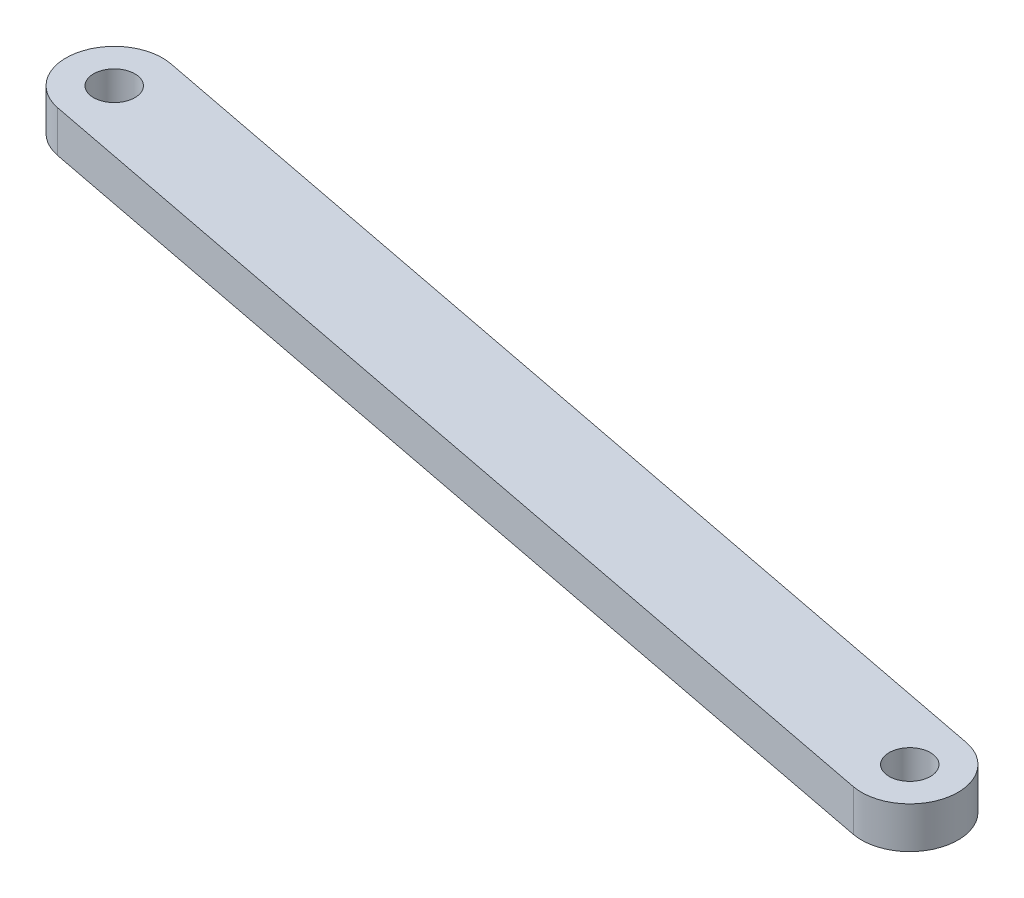
ISO-10303-21;
HEADER;
FILE_DESCRIPTION(('STEP AP214'),'2;1');
FILE_NAME('part.step','',(''),(''),'','','');
FILE_SCHEMA(('AUTOMOTIVE_DESIGN { 1 0 10303 214 1 1 1 1 }'));
ENDSEC;
DATA;
#1=APPLICATION_CONTEXT('core data for automotive mechanical design processes');
#2=APPLICATION_PROTOCOL_DEFINITION('international standard','automotive_design',2000,#1);
#3=PRODUCT_CONTEXT('',#1,'mechanical');
#4=PRODUCT('Part','Part','',(#3));
#5=PRODUCT_RELATED_PRODUCT_CATEGORY('part','',(#4));
#6=PRODUCT_DEFINITION_FORMATION('','',#4);
#7=PRODUCT_DEFINITION_CONTEXT('part definition',#1,'design');
#8=PRODUCT_DEFINITION('design','',#6,#7);
#9=PRODUCT_DEFINITION_SHAPE('','',#8);
#10=(LENGTH_UNIT() NAMED_UNIT(*) SI_UNIT(.MILLI.,.METRE.));
#11=(NAMED_UNIT(*) PLANE_ANGLE_UNIT() SI_UNIT($,.RADIAN.));
#12=(NAMED_UNIT(*) SI_UNIT($,.STERADIAN.) SOLID_ANGLE_UNIT());
#13=UNCERTAINTY_MEASURE_WITH_UNIT(LENGTH_MEASURE(1.E-05),#10,'distance_accuracy_value','');
#14=(GEOMETRIC_REPRESENTATION_CONTEXT(3) GLOBAL_UNCERTAINTY_ASSIGNED_CONTEXT((#13)) GLOBAL_UNIT_ASSIGNED_CONTEXT((#10,
#11,#12)) REPRESENTATION_CONTEXT('',''));
#15=CARTESIAN_POINT('',(0.,0.,0.));
#16=DIRECTION('',(0.,0.,1.));
#17=DIRECTION('',(1.,0.,0.));
#18=AXIS2_PLACEMENT_3D('',#15,#16,#17);
#19=CARTESIAN_POINT('',(-5.00000060963349,87.0000000000011,-87.4999997220752));
#20=DIRECTION('',(0.,-1.,0.));
#21=DIRECTION('',(0.,0.,-1.));
#22=AXIS2_PLACEMENT_3D('',#19,#20,#21);
#23=CYLINDRICAL_SURFACE('',#22,3.50000000000001);
#24=CARTESIAN_POINT('',(-5.00000060963349,84.0000000000011,-87.4999997220752));
#25=DIRECTION('',(0.,1.,0.));
#26=DIRECTION('',(0.,0.,1.));
#27=AXIS2_PLACEMENT_3D('',#24,#25,#26);
#28=CIRCLE('',#27,3.50000000000001);
#29=CARTESIAN_POINT('',(-4.33725103951117,84.0000000000011,-90.9366787887474));
#30=VERTEX_POINT('',#29);
#31=CARTESIAN_POINT('',(-5.66275017975581,84.0000000000011,-84.063320655403));
#32=VERTEX_POINT('',#31);
#33=EDGE_CURVE('E109',#30,#32,#28,.F.);
#34=ORIENTED_EDGE('',*,*,#33,.F.);
#35=DIRECTION('',(0.,-1.,0.));
#36=VECTOR('',#35,1.);
#37=CARTESIAN_POINT('',(-4.33725103951117,87.0000000000011,-90.9366787887474));
#38=LINE('',#37,#36);
#39=CARTESIAN_POINT('',(-4.33725103951117,87.0000000000011,-90.9366787887474));
#40=VERTEX_POINT('',#39);
#41=EDGE_CURVE('E11',#40,#30,#38,.T.);
#42=ORIENTED_EDGE('',*,*,#41,.F.);
#43=CARTESIAN_POINT('',(-5.00000060963349,87.0000000000011,-87.4999997220752));
#44=DIRECTION('',(0.,1.,0.));
#45=DIRECTION('',(0.,0.,1.));
#46=AXIS2_PLACEMENT_3D('',#43,#44,#45);
#47=CIRCLE('',#46,3.50000000000001);
#48=CARTESIAN_POINT('',(-5.66275017975581,87.0000000000011,-84.063320655403));
#49=VERTEX_POINT('',#48);
#50=EDGE_CURVE('E95',#40,#49,#47,.F.);
#51=ORIENTED_EDGE('',*,*,#50,.T.);
#52=DIRECTION('',(0.,-1.,0.));
#53=VECTOR('',#52,1.);
#54=CARTESIAN_POINT('',(-5.66275017975581,87.0000000000011,-84.063320655403));
#55=LINE('',#54,#53);
#56=EDGE_CURVE('E55',#49,#32,#55,.T.);
#57=ORIENTED_EDGE('',*,*,#56,.T.);
#58=EDGE_LOOP('',(#34,#42,#51,#57));
#59=FACE_BOUND('',#58,.T.);
#60=ADVANCED_FACE('F39',(#59),#23,.T.);
#61=CARTESIAN_POINT('',(16.7524517634441,87.0000000000011,-86.8696154419797));
#62=DIRECTION('',(0.189357020034949,0.,-0.981908304763476));
#63=DIRECTION('',(-0.981908304763476,0.,-0.189357020034949));
#64=AXIS2_PLACEMENT_3D('',#61,#62,#63);
#65=PLANE('',#64);
#66=DIRECTION('',(0.981908304763476,0.,0.189357020034949));
#67=VECTOR('',#66,1.);
#68=CARTESIAN_POINT('',(16.7524517634441,84.0000000000011,-86.8696154419797));
#69=LINE('',#68,#67);
#70=CARTESIAN_POINT('',(-75.8418948291045,84.0000000000011,-104.726058307153));
#71=VERTEX_POINT('',#70);
#72=EDGE_CURVE('E85',#71,#30,#69,.T.);
#73=ORIENTED_EDGE('',*,*,#72,.F.);
#74=DIRECTION('',(0.,-1.,0.));
#75=VECTOR('',#74,1.);
#76=CARTESIAN_POINT('',(-75.8418948291045,87.0000000000011,-104.726058307153));
#77=LINE('',#76,#75);
#78=CARTESIAN_POINT('',(-75.8418948291045,87.0000000000011,-104.726058307153));
#79=VERTEX_POINT('',#78);
#80=EDGE_CURVE('E47',#79,#71,#77,.T.);
#81=ORIENTED_EDGE('',*,*,#80,.F.);
#82=DIRECTION('',(0.981908304763476,0.,0.189357020034949));
#83=VECTOR('',#82,1.);
#84=CARTESIAN_POINT('',(16.7524517634441,87.0000000000011,-86.8696154419797));
#85=LINE('',#84,#83);
#86=EDGE_CURVE('E83',#79,#40,#85,.T.);
#87=ORIENTED_EDGE('',*,*,#86,.T.);
#88=ORIENTED_EDGE('',*,*,#41,.T.);
#89=EDGE_LOOP('',(#73,#81,#87,#88));
#90=FACE_BOUND('',#89,.T.);
#91=ADVANCED_FACE('F82',(#90),#65,.T.);
#92=CARTESIAN_POINT('',(-76.5046443992268,87.0000000000011,-101.289379240481));
#93=DIRECTION('',(0.,-1.,0.));
#94=DIRECTION('',(0.,0.,-1.));
#95=AXIS2_PLACEMENT_3D('',#92,#93,#94);
#96=CYLINDRICAL_SURFACE('',#95,3.50000000000001);
#97=CARTESIAN_POINT('',(-76.5046443992268,84.0000000000011,-101.289379240481));
#98=DIRECTION('',(0.,1.,0.));
#99=DIRECTION('',(0.,0.,1.));
#100=AXIS2_PLACEMENT_3D('',#97,#98,#99);
#101=CIRCLE('',#100,3.50000000000001);
#102=CARTESIAN_POINT('',(-77.1673939693492,84.0000000000011,-97.8527001738087));
#103=VERTEX_POINT('',#102);
#104=EDGE_CURVE('E112',#103,#71,#101,.F.);
#105=ORIENTED_EDGE('',*,*,#104,.F.);
#106=DIRECTION('',(0.,-1.,0.));
#107=VECTOR('',#106,1.);
#108=CARTESIAN_POINT('',(-77.1673939693492,87.0000000000011,-97.8527001738087));
#109=LINE('',#108,#107);
#110=CARTESIAN_POINT('',(-77.1673939693492,87.0000000000011,-97.8527001738087));
#111=VERTEX_POINT('',#110);
#112=EDGE_CURVE('E68',#111,#103,#109,.T.);
#113=ORIENTED_EDGE('',*,*,#112,.F.);
#114=CARTESIAN_POINT('',(-76.5046443992268,87.0000000000011,-101.289379240481));
#115=DIRECTION('',(0.,1.,0.));
#116=DIRECTION('',(0.,0.,1.));
#117=AXIS2_PLACEMENT_3D('',#114,#115,#116);
#118=CIRCLE('',#117,3.50000000000001);
#119=EDGE_CURVE('E94',#111,#79,#118,.F.);
#120=ORIENTED_EDGE('',*,*,#119,.T.);
#121=ORIENTED_EDGE('',*,*,#80,.T.);
#122=EDGE_LOOP('',(#105,#113,#120,#121));
#123=FACE_BOUND('',#122,.T.);
#124=ADVANCED_FACE('F97',(#123),#96,.T.);
#125=CARTESIAN_POINT('',(-5.00000060963349,87.0000000000011,-87.4999997220752));
#126=DIRECTION('',(0.,-1.,0.));
#127=DIRECTION('',(0.,0.,-1.));
#128=AXIS2_PLACEMENT_3D('',#125,#126,#127);
#129=CYLINDRICAL_SURFACE('',#128,1.5);
#130=CARTESIAN_POINT('',(-5.00000060963349,87.0000000000011,-87.4999997220752));
#131=DIRECTION('',(0.,1.,0.));
#132=DIRECTION('',(0.,0.,1.));
#133=AXIS2_PLACEMENT_3D('',#130,#131,#132);
#134=CIRCLE('',#133,1.5);
#135=CARTESIAN_POINT('',(-5.00000060963349,87.0000000000011,-85.9999997220752));
#136=VERTEX_POINT('',#135);
#137=EDGE_CURVE('E100',#136,#136,#134,.F.);
#138=ORIENTED_EDGE('',*,*,#137,.F.);
#139=EDGE_LOOP('',(#138));
#140=FACE_BOUND('',#139,.T.);
#141=CARTESIAN_POINT('',(-5.00000060963349,84.0000000000011,-87.4999997220752));
#142=DIRECTION('',(0.,1.,0.));
#143=DIRECTION('',(0.,0.,1.));
#144=AXIS2_PLACEMENT_3D('',#141,#142,#143);
#145=CIRCLE('',#144,1.5);
#146=CARTESIAN_POINT('',(-5.00000060963349,84.0000000000011,-85.9999997220752));
#147=VERTEX_POINT('',#146);
#148=EDGE_CURVE('E117',#147,#147,#145,.F.);
#149=ORIENTED_EDGE('',*,*,#148,.T.);
#150=EDGE_LOOP('',(#149));
#151=FACE_BOUND('',#150,.T.);
#152=ADVANCED_FACE('F129',(#140,#151),#129,.F.);
#153=CARTESIAN_POINT('',(15.4269526231994,87.0000000000011,-79.9962573086354));
#154=DIRECTION('',(-0.189357020034949,0.,0.981908304763476));
#155=DIRECTION('',(0.981908304763476,0.,0.189357020034949));
#156=AXIS2_PLACEMENT_3D('',#153,#154,#155);
#157=PLANE('',#156);
#158=DIRECTION('',(-0.981908304763476,0.,-0.189357020034949));
#159=VECTOR('',#158,1.);
#160=CARTESIAN_POINT('',(15.4269526231994,84.0000000000011,-79.9962573086354));
#161=LINE('',#160,#159);
#162=EDGE_CURVE('E114',#32,#103,#161,.T.);
#163=ORIENTED_EDGE('',*,*,#162,.F.);
#164=ORIENTED_EDGE('',*,*,#56,.F.);
#165=DIRECTION('',(-0.981908304763476,0.,-0.189357020034949));
#166=VECTOR('',#165,1.);
#167=CARTESIAN_POINT('',(15.4269526231994,87.0000000000011,-79.9962573086354));
#168=LINE('',#167,#166);
#169=EDGE_CURVE('E98',#49,#111,#168,.T.);
#170=ORIENTED_EDGE('',*,*,#169,.T.);
#171=ORIENTED_EDGE('',*,*,#112,.T.);
#172=EDGE_LOOP('',(#163,#164,#170,#171));
#173=FACE_BOUND('',#172,.T.);
#174=ADVANCED_FACE('F126',(#173),#157,.T.);
#175=CARTESIAN_POINT('',(-76.5046443992268,87.0000000000011,-101.289379240481));
#176=DIRECTION('',(0.,-1.,0.));
#177=DIRECTION('',(0.,0.,-1.));
#178=AXIS2_PLACEMENT_3D('',#175,#176,#177);
#179=CYLINDRICAL_SURFACE('',#178,1.50000000003191);
#180=CARTESIAN_POINT('',(-76.5046443992268,87.0000000000011,-101.289379240481));
#181=DIRECTION('',(0.,1.,0.));
#182=DIRECTION('',(0.,0.,1.));
#183=AXIS2_PLACEMENT_3D('',#180,#181,#182);
#184=CIRCLE('',#183,1.50000000003191);
#185=CARTESIAN_POINT('',(-76.5046443992268,87.0000000000011,-99.789379240449));
#186=VERTEX_POINT('',#185);
#187=EDGE_CURVE('E106',#186,#186,#184,.T.);
#188=ORIENTED_EDGE('',*,*,#187,.T.);
#189=EDGE_LOOP('',(#188));
#190=FACE_BOUND('',#189,.T.);
#191=CARTESIAN_POINT('',(-76.5046443992268,84.0000000000011,-101.289379240481));
#192=DIRECTION('',(0.,1.,0.));
#193=DIRECTION('',(0.,0.,1.));
#194=AXIS2_PLACEMENT_3D('',#191,#192,#193);
#195=CIRCLE('',#194,1.50000000003191);
#196=CARTESIAN_POINT('',(-76.5046443992268,84.0000000000011,-99.789379240449));
#197=VERTEX_POINT('',#196);
#198=EDGE_CURVE('E120',#197,#197,#195,.T.);
#199=ORIENTED_EDGE('',*,*,#198,.F.);
#200=EDGE_LOOP('',(#199));
#201=FACE_BOUND('',#200,.T.);
#202=ADVANCED_FACE('F128',(#190,#201),#179,.F.);
#203=CARTESIAN_POINT('',(0.,87.0000000000011,0.));
#204=DIRECTION('',(0.,1.,0.));
#205=DIRECTION('',(0.,0.,1.));
#206=AXIS2_PLACEMENT_3D('',#203,#204,#205);
#207=PLANE('',#206);
#208=ORIENTED_EDGE('',*,*,#50,.F.);
#209=ORIENTED_EDGE('',*,*,#86,.F.);
#210=ORIENTED_EDGE('',*,*,#119,.F.);
#211=ORIENTED_EDGE('',*,*,#169,.F.);
#212=EDGE_LOOP('',(#208,#209,#210,#211));
#213=FACE_BOUND('',#212,.T.);
#214=ORIENTED_EDGE('',*,*,#137,.T.);
#215=EDGE_LOOP('',(#214));
#216=FACE_BOUND('',#215,.T.);
#217=ORIENTED_EDGE('',*,*,#187,.F.);
#218=EDGE_LOOP('',(#217));
#219=FACE_BOUND('',#218,.T.);
#220=ADVANCED_FACE('F91',(#213,#216,#219),#207,.T.);
#221=CARTESIAN_POINT('',(0.,84.0000000000011,0.));
#222=DIRECTION('',(0.,1.,0.));
#223=DIRECTION('',(0.,0.,1.));
#224=AXIS2_PLACEMENT_3D('',#221,#222,#223);
#225=PLANE('',#224);
#226=ORIENTED_EDGE('',*,*,#33,.T.);
#227=ORIENTED_EDGE('',*,*,#162,.T.);
#228=ORIENTED_EDGE('',*,*,#104,.T.);
#229=ORIENTED_EDGE('',*,*,#72,.T.);
#230=EDGE_LOOP('',(#226,#227,#228,#229));
#231=FACE_BOUND('',#230,.T.);
#232=ORIENTED_EDGE('',*,*,#148,.F.);
#233=EDGE_LOOP('',(#232));
#234=FACE_BOUND('',#233,.T.);
#235=ORIENTED_EDGE('',*,*,#198,.T.);
#236=EDGE_LOOP('',(#235));
#237=FACE_BOUND('',#236,.T.);
#238=ADVANCED_FACE('F169',(#231,#234,#237),#225,.F.);
#239=CLOSED_SHELL('',(#60,#91,#124,#152,#174,#202,#220,#238));
#240=MANIFOLD_SOLID_BREP('B2',#239);
#241=ADVANCED_BREP_SHAPE_REPRESENTATION('',(#18,#240),#14);
#242=SHAPE_DEFINITION_REPRESENTATION(#9,#241);
ENDSEC;
END-ISO-10303-21;
